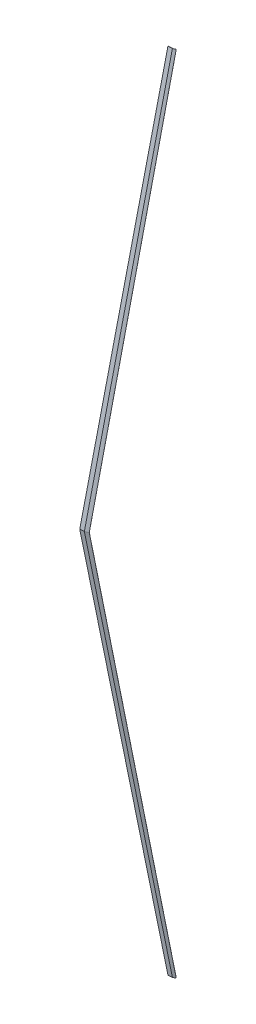
ISO-10303-21;
HEADER;
FILE_DESCRIPTION(('STEP AP214'),'2;1');
FILE_NAME('part.step','',(''),(''),'','','');
FILE_SCHEMA(('AUTOMOTIVE_DESIGN { 1 0 10303 214 1 1 1 1 }'));
ENDSEC;
DATA;
#1=APPLICATION_CONTEXT('core data for automotive mechanical design processes');
#2=APPLICATION_PROTOCOL_DEFINITION('international standard','automotive_design',2000,#1);
#3=PRODUCT_CONTEXT('',#1,'mechanical');
#4=PRODUCT('Part','Part','',(#3));
#5=PRODUCT_RELATED_PRODUCT_CATEGORY('part','',(#4));
#6=PRODUCT_DEFINITION_FORMATION('','',#4);
#7=PRODUCT_DEFINITION_CONTEXT('part definition',#1,'design');
#8=PRODUCT_DEFINITION('design','',#6,#7);
#9=PRODUCT_DEFINITION_SHAPE('','',#8);
#10=(LENGTH_UNIT() NAMED_UNIT(*) SI_UNIT(.MILLI.,.METRE.));
#11=(NAMED_UNIT(*) PLANE_ANGLE_UNIT() SI_UNIT($,.RADIAN.));
#12=(NAMED_UNIT(*) SI_UNIT($,.STERADIAN.) SOLID_ANGLE_UNIT());
#13=UNCERTAINTY_MEASURE_WITH_UNIT(LENGTH_MEASURE(1.E-05),#10,'distance_accuracy_value','');
#14=(GEOMETRIC_REPRESENTATION_CONTEXT(3) GLOBAL_UNCERTAINTY_ASSIGNED_CONTEXT((#13)) GLOBAL_UNIT_ASSIGNED_CONTEXT((#10,
#11,#12)) REPRESENTATION_CONTEXT('',''));
#15=CARTESIAN_POINT('',(0.,0.,0.));
#16=DIRECTION('',(0.,0.,1.));
#17=DIRECTION('',(1.,0.,0.));
#18=AXIS2_PLACEMENT_3D('',#15,#16,#17);
#19=CARTESIAN_POINT('',(-233.035520573233,-390.348529640337,62.8481939552668));
#20=DIRECTION('',(0.,-1.,0.));
#21=DIRECTION('',(0.,0.,-1.));
#22=AXIS2_PLACEMENT_3D('',#19,#20,#21);
#23=PLANE('',#22);
#24=CARTESIAN_POINT('',(-233.035520573233,-390.348529640337,62.8481939552668));
#25=DIRECTION('',(0.,-1.,0.));
#26=DIRECTION('',(0.,0.,-1.));
#27=AXIS2_PLACEMENT_3D('',#24,#25,#26);
#28=CIRCLE('',#27,25.3190411966632);
#29=CARTESIAN_POINT('',(-219.487021161743,-390.348529640337,84.2372568336441));
#30=VERTEX_POINT('',#29);
#31=CARTESIAN_POINT('',(-225.419030916607,-390.348529640337,86.9944759139622));
#32=VERTEX_POINT('',#31);
#33=EDGE_CURVE('E121',#30,#32,#28,.T.);
#34=ORIENTED_EDGE('',*,*,#33,.T.);
#35=CARTESIAN_POINT('',(-225.419030916607,-390.348529640337,86.9944759139622));
#36=CARTESIAN_POINT('',(-226.05242857636,-390.348529640337,87.0388025008623));
#37=CARTESIAN_POINT('',(-228.387446488872,-390.348529640337,87.204047564457));
#38=CARTESIAN_POINT('',(-230.927518861756,-390.348529640337,87.3976454493604));
#39=CARTESIAN_POINT('',(-232.833242050514,-390.348529640337,87.557767353734));
#40=CARTESIAN_POINT('',(-233.039030916517,-390.348529640337,87.5751812859225));
#41=B_SPLINE_CURVE_WITH_KNOTS('',3,(#35,#36,#37,#38,#39,#40),.UNSPECIFIED.,.F.,.F.,(4,1,1,4),
(25.9390049786338,26.0139986929523,26.2154839827386,26.2398765286644),.UNSPECIFIED.);
#42=CARTESIAN_POINT('',(-233.039030916517,-390.348529640337,87.5751812859225));
#43=VERTEX_POINT('',#42);
#44=EDGE_CURVE('E131',#32,#43,#41,.T.);
#45=ORIENTED_EDGE('',*,*,#44,.T.);
#46=DIRECTION('',(0.0820459575074956,0.,0.996628547080946));
#47=VECTOR('',#46,1.);
#48=CARTESIAN_POINT('',(-233.058807937216,-390.348529640337,87.3349458861057));
#49=LINE('',#48,#47);
#50=CARTESIAN_POINT('',(-233.058807937216,-390.348529640337,87.3349458861057));
#51=VERTEX_POINT('',#50);
#52=EDGE_CURVE('E345',#51,#43,#49,.T.);
#53=ORIENTED_EDGE('',*,*,#52,.F.);
#54=CARTESIAN_POINT('',(-225.466843131213,-390.348529640337,86.7432020515552));
#55=CARTESIAN_POINT('',(-227.999061344912,-390.348529640337,86.9206405705874));
#56=CARTESIAN_POINT('',(-230.529137195553,-390.348529640337,87.1266945182334));
#57=CARTESIAN_POINT('',(-233.058807937216,-390.348529640337,87.3349458861057));
#58=B_SPLINE_CURVE_WITH_KNOTS('',3,(#54,#55,#56,#57),.UNSPECIFIED.,.F.,.F.,(4,4),
(25.9401918871156,26.2399437403012),.UNSPECIFIED.);
#59=CARTESIAN_POINT('',(-225.466843131213,-390.348529640337,86.7432020515552));
#60=VERTEX_POINT('',#59);
#61=EDGE_CURVE('E347',#60,#51,#58,.T.);
#62=ORIENTED_EDGE('',*,*,#61,.F.);
#63=CARTESIAN_POINT('',(-233.035520573145,-390.348529640337,62.8481939550198));
#64=DIRECTION('',(0.,-1.,0.));
#65=DIRECTION('',(0.,0.,-1.));
#66=AXIS2_PLACEMENT_3D('',#63,#64,#65);
#67=CIRCLE('',#66,25.0650411959269);
#68=CARTESIAN_POINT('',(-219.622939375828,-390.348529640337,84.0226822789179));
#69=VERTEX_POINT('',#68);
#70=EDGE_CURVE('E123',#69,#60,#67,.T.);
#71=ORIENTED_EDGE('',*,*,#70,.F.);
#72=DIRECTION('',(0.535111077182952,0.,0.844781708535466));
#73=VECTOR('',#72,1.);
#74=CARTESIAN_POINT('',(-219.622939375828,-390.348529640337,84.0226822789178));
#75=LINE('',#74,#73);
#76=EDGE_CURVE('E105',#69,#30,#75,.T.);
#77=ORIENTED_EDGE('',*,*,#76,.T.);
#78=EDGE_LOOP('',(#34,#45,#53,#62,#71,#77));
#79=FACE_BOUND('',#78,.T.);
#80=ADVANCED_FACE('F46',(#79),#23,.T.);
#81=CARTESIAN_POINT('',(-182.173466429646,320.773624764959,-38.026053356457));
#82=DIRECTION('',(0.,0.990268068741507,-0.139173100960514));
#83=DIRECTION('',(0.,0.139173100960514,0.990268068741507));
#84=AXIS2_PLACEMENT_3D('',#81,#82,#83);
#85=PLANE('',#84);
#86=CARTESIAN_POINT('',(-182.173466429646,320.773624764959,-38.026053356457));
#87=DIRECTION('',(0.,0.990268068741507,-0.139173100960514));
#88=DIRECTION('',(0.,0.139173100960514,0.990268068741507));
#89=AXIS2_PLACEMENT_3D('',#86,#87,#88);
#90=CIRCLE('',#89,19.6993494457085);
#91=CARTESIAN_POINT('',(-175.753410921286,323.365561729886,-19.5834635539491));
#92=VERTEX_POINT('',#91);
#93=CARTESIAN_POINT('',(-171.230800894713,323.053356794265,-21.8049171000385));
#94=VERTEX_POINT('',#93);
#95=EDGE_CURVE('E176',#92,#94,#90,.T.);
#96=ORIENTED_EDGE('',*,*,#95,.T.);
#97=DIRECTION('',(0.555483599349926,0.115726259671109,0.823435124145057));
#98=VECTOR('',#97,1.);
#99=CARTESIAN_POINT('',(-171.371893728947,323.023962324309,-22.0140696215703));
#100=LINE('',#99,#98);
#101=CARTESIAN_POINT('',(-171.371893728947,323.023962324309,-22.0140696215703));
#102=VERTEX_POINT('',#101);
#103=EDGE_CURVE('E109',#102,#94,#100,.T.);
#104=ORIENTED_EDGE('',*,*,#103,.F.);
#105=CARTESIAN_POINT('',(-182.173466429646,320.773624764959,-38.026053356457));
#106=DIRECTION('',(0.,0.990268068741507,-0.139173100960514));
#107=DIRECTION('',(0.,0.139173100960514,0.990268068741507));
#108=AXIS2_PLACEMENT_3D('',#105,#106,#107);
#109=CIRCLE('',#108,19.4453494457098);
#110=CARTESIAN_POINT('',(-175.800812821062,323.330439180313,-19.8333734797535));
#111=VERTEX_POINT('',#110);
#112=EDGE_CURVE('E294',#111,#102,#109,.T.);
#113=ORIENTED_EDGE('',*,*,#112,.F.);
#114=CARTESIAN_POINT('',(-175.800812821062,323.330439180313,-19.8333734797535));
#115=CARTESIAN_POINT('',(-178.329054778178,323.343965245203,-19.7371305271745));
#116=CARTESIAN_POINT('',(-180.856958237986,323.358467984337,-19.6339381762459));
#117=CARTESIAN_POINT('',(-183.384521368774,323.373920571786,-19.5239873033771));
#118=B_SPLINE_CURVE_WITH_KNOTS('',3,(#114,#115,#116,#117),.UNSPECIFIED.,.F.,.F.,(4,4),
(17.9263680857963,18.2251470740458),.UNSPECIFIED.);
#119=CARTESIAN_POINT('',(-183.384521368774,323.373920571786,-19.5239873033771));
#120=VERTEX_POINT('',#119);
#121=EDGE_CURVE('E297',#111,#120,#118,.T.);
#122=ORIENTED_EDGE('',*,*,#121,.T.);
#123=DIRECTION('',(0.0438859264504888,0.13903901444274,0.98931399359474));
#124=VECTOR('',#123,1.);
#125=CARTESIAN_POINT('',(-183.384521368774,323.373920571786,-19.5239873033771));
#126=LINE('',#125,#124);
#127=CARTESIAN_POINT('',(-183.373410921285,323.409120595892,-19.2735261176268));
#128=VERTEX_POINT('',#127);
#129=EDGE_CURVE('E57',#120,#128,#126,.T.);
#130=ORIENTED_EDGE('',*,*,#129,.T.);
#131=CARTESIAN_POINT('',(-175.753410921286,323.365561729886,-19.5834635539491));
#132=CARTESIAN_POINT('',(-176.085103513536,323.36733500676,-19.5708460333691));
#133=CARTESIAN_POINT('',(-177.536033603902,323.375161982005,-19.5151542106975));
#134=CARTESIAN_POINT('',(-180.076120457415,323.389400616283,-19.4138410634644));
#135=CARTESIAN_POINT('',(-182.284327155147,323.402490644535,-19.3207006727781));
#136=CARTESIAN_POINT('',(-183.373410921285,323.409120595892,-19.2735261176268));
#137=B_SPLINE_CURVE_WITH_KNOTS('',3,(#131,#132,#133,#134,#135,#136),.UNSPECIFIED.,.F.,.F.,(4,1,
1,4),(17.924884890901,17.9640900656302,18.0963832191326,18.2251381301152),.UNSPECIFIED.);
#138=EDGE_CURVE('E12',#92,#128,#137,.T.);
#139=ORIENTED_EDGE('',*,*,#138,.F.);
#140=EDGE_LOOP('',(#96,#104,#113,#122,#130,#139));
#141=FACE_BOUND('',#140,.T.);
#142=ADVANCED_FACE('F255',(#141),#85,.T.);
#143=CARTESIAN_POINT('',(-183.384521368774,323.373920571786,-19.5239873033771));
#144=CARTESIAN_POINT('',(-233.058807937216,-390.348529640337,87.3349458861057));
#145=CARTESIAN_POINT('',(-182.120712190387,323.366194109246,-19.5789639409972));
#146=CARTESIAN_POINT('',(-231.793895060903,-390.348529640337,87.2308138216465));
#147=CARTESIAN_POINT('',(-180.856832215005,323.358706318364,-19.6322423415263));
#148=CARTESIAN_POINT('',(-230.528857934003,-390.348529640337,87.1283360371742));
#149=CARTESIAN_POINT('',(-178.328930670252,323.344208079916,-19.7354026684028));
#150=CARTESIAN_POINT('',(-227.998535179031,-390.348529640337,86.9266890282033));
#151=CARTESIAN_POINT('',(-177.064907796396,323.337202073641,-19.7852529933325));
#152=CARTESIAN_POINT('',(-226.732917370597,-390.348529640337,86.8319188678255));
#153=CARTESIAN_POINT('',(-175.800812821062,323.330439180313,-19.8333734797535));
#154=CARTESIAN_POINT('',(-225.466843131213,-390.348529640337,86.7432020515552));
#155=B_SPLINE_SURFACE_WITH_KNOTS('',3,1,((#143,#144),(#145,#146),(#147,#148),(#149,#150),(#151,
#152),(#153,#154)),.UNSPECIFIED.,.F.,.F.,.F.,(4,2,4),(2,2),(0.,0.5,1.),(0.,1.),.UNSPECIFIED.);
#156=DIRECTION('',(-0.0686658750010849,-0.986698364212233,0.147347669378374));
#157=VECTOR('',#156,1.);
#158=CARTESIAN_POINT('',(-200.633827976137,-33.509045230012,33.4549142859008));
#159=LINE('',#158,#157);
#160=EDGE_CURVE('E301',#111,#60,#159,.T.);
#161=DIRECTION('',(0.068669207938254,0.986642360253912,-0.147720658114301));
#162=VECTOR('',#161,1.);
#163=CARTESIAN_POINT('',(-208.221664652995,-33.4873045342752,33.9054792913643));
#164=LINE('',#163,#162);
#165=EDGE_CURVE('E190',#51,#120,#164,.T.);
#166=ORIENTED_EDGE('',*,*,#121,.F.);
#167=ORIENTED_EDGE('',*,*,#160,.T.);
#168=ORIENTED_EDGE('',*,*,#61,.T.);
#169=ORIENTED_EDGE('',*,*,#165,.T.);
#170=EDGE_LOOP('',(#166,#167,#168,#169));
#171=FACE_BOUND('',#170,.T.);
#172=ADVANCED_FACE('F208',(#171),#155,.T.);
#173=CARTESIAN_POINT('',(-175.800812821062,323.330439180313,-19.8333734797536));
#174=CARTESIAN_POINT('',(-225.466843131213,-390.348529640337,86.7432020515556));
#175=CARTESIAN_POINT('',(-174.24313822684,323.255240806138,-20.3684377145303));
#176=CARTESIAN_POINT('',(-223.418438427037,-390.348529640337,86.0943755513172));
#177=CARTESIAN_POINT('',(-172.742855040637,323.151422681566,-21.1071420547403));
#178=CARTESIAN_POINT('',(-221.438126937848,-390.348529640337,85.1724786844571));
#179=CARTESIAN_POINT('',(-171.371893728947,323.023962324309,-22.0140696215703));
#180=CARTESIAN_POINT('',(-219.622939375828,-390.348529640337,84.0226822789179));
#181=B_SPLINE_SURFACE_WITH_KNOTS('',3,1,((#173,#174),(#175,#176),(#177,#178),(#179,#180)),
.UNSPECIFIED.,.F.,.F.,.F.,(4,4),(2,2),(0.,1.),(0.,1.),.UNSPECIFIED.);
#182=DIRECTION('',(-0.0667536638312013,-0.986926332406081,0.146698203017602));
#183=VECTOR('',#182,1.);
#184=CARTESIAN_POINT('',(-195.497416552388,-33.662283658014,31.0043063286738));
#185=LINE('',#184,#183);
#186=EDGE_CURVE('E97',#102,#69,#185,.T.);
#187=ORIENTED_EDGE('',*,*,#112,.T.);
#188=ORIENTED_EDGE('',*,*,#186,.T.);
#189=ORIENTED_EDGE('',*,*,#70,.T.);
#190=ORIENTED_EDGE('',*,*,#160,.F.);
#191=EDGE_LOOP('',(#187,#188,#189,#190));
#192=FACE_BOUND('',#191,.T.);
#193=ADVANCED_FACE('F196',(#192),#181,.T.);
#194=CARTESIAN_POINT('',(-183.373410921285,323.409120595892,-19.2735261176268));
#195=CARTESIAN_POINT('',(-233.039030916517,-390.348529640337,87.5751812859225));
#196=CARTESIAN_POINT('',(-183.375262662533,323.403253925208,-19.3152696485851));
#197=CARTESIAN_POINT('',(-233.042327086633,-390.348529640337,87.5351420526196));
#198=CARTESIAN_POINT('',(-183.377114403781,323.397387254524,-19.3570131795435));
#199=CARTESIAN_POINT('',(-233.04562325675,-390.348529640337,87.4951028193168));
#200=CARTESIAN_POINT('',(-183.380817886278,323.385653913155,-19.4405002414603));
#201=CARTESIAN_POINT('',(-233.052215596983,-390.348529640337,87.4150243527112));
#202=CARTESIAN_POINT('',(-183.382669627526,323.379787242471,-19.4822437724187));
#203=CARTESIAN_POINT('',(-233.055511767099,-390.348529640337,87.3749851194084));
#204=CARTESIAN_POINT('',(-183.384521368774,323.373920571786,-19.5239873033771));
#205=CARTESIAN_POINT('',(-233.058807937216,-390.348529640337,87.3349458861057));
#206=B_SPLINE_SURFACE_WITH_KNOTS('',3,1,((#194,#195),(#196,#197),(#198,#199),(#200,#201),(#202,
#203),(#204,#205)),.UNSPECIFIED.,.F.,.F.,.F.,(4,2,4),(2,2),(0.,0.5,1.),(0.,1.),.UNSPECIFIED.);
#207=DIRECTION('',(-0.0686541310842447,-0.986646523015419,0.147699860889074));
#208=VECTOR('',#207,1.);
#209=CARTESIAN_POINT('',(-208.206220918901,-33.4697045222222,34.1508275841478));
#210=LINE('',#209,#208);
#211=EDGE_CURVE('E66',#128,#43,#210,.T.);
#212=ORIENTED_EDGE('',*,*,#129,.F.);
#213=ORIENTED_EDGE('',*,*,#165,.F.);
#214=ORIENTED_EDGE('',*,*,#52,.T.);
#215=ORIENTED_EDGE('',*,*,#211,.F.);
#216=EDGE_LOOP('',(#212,#213,#214,#215));
#217=FACE_BOUND('',#216,.T.);
#218=ADVANCED_FACE('F207',(#217),#206,.T.);
#219=CARTESIAN_POINT('',(-171.371893728947,323.023962324309,-22.0140696215703));
#220=CARTESIAN_POINT('',(-219.622939375828,-390.348529640337,84.0226822789179));
#221=CARTESIAN_POINT('',(-171.348378256575,323.028861402635,-21.9792108679816));
#222=CARTESIAN_POINT('',(-219.600286340147,-390.348529640337,84.0584447047056));
#223=CARTESIAN_POINT('',(-171.324862784203,323.033760480961,-21.944352114393));
#224=CARTESIAN_POINT('',(-219.577633304466,-390.348529640337,84.0942071304933));
#225=CARTESIAN_POINT('',(-171.277831839458,323.043558637613,-21.8746346072158));
#226=CARTESIAN_POINT('',(-219.532327233105,-390.348529640337,84.1657319820687));
#227=CARTESIAN_POINT('',(-171.254316367085,323.048457715939,-21.8397758536271));
#228=CARTESIAN_POINT('',(-219.509674197424,-390.348529640337,84.2014944078564));
#229=CARTESIAN_POINT('',(-171.230800894713,323.053356794265,-21.8049171000385));
#230=CARTESIAN_POINT('',(-219.487021161743,-390.348529640337,84.2372568336441));
#231=B_SPLINE_SURFACE_WITH_KNOTS('',3,1,((#219,#220),(#221,#222),(#223,#224),(#225,#226),(#227,
#228),(#229,#230)),.UNSPECIFIED.,.F.,.F.,.F.,(4,2,4),(2,2),(0.,0.5,1.),(0.,1.),.UNSPECIFIED.);
#232=DIRECTION('',(-0.0667580380697901,-0.986925831118192,0.146699584950808));
#233=VECTOR('',#232,1.);
#234=CARTESIAN_POINT('',(-195.358911028228,-33.6475864230359,31.2161698668028));
#235=LINE('',#234,#233);
#236=EDGE_CURVE('E102',#94,#30,#235,.T.);
#237=ORIENTED_EDGE('',*,*,#103,.T.);
#238=ORIENTED_EDGE('',*,*,#236,.T.);
#239=ORIENTED_EDGE('',*,*,#76,.F.);
#240=ORIENTED_EDGE('',*,*,#186,.F.);
#241=EDGE_LOOP('',(#237,#238,#239,#240));
#242=FACE_BOUND('',#241,.T.);
#243=ADVANCED_FACE('F104',(#242),#231,.T.);
#244=CARTESIAN_POINT('',(-171.230800894713,323.053356794265,-21.8049171000385));
#245=CARTESIAN_POINT('',(-219.487021161743,-390.348529640337,84.2372568336441));
#246=CARTESIAN_POINT('',(-172.630094993278,323.183451293789,-20.8792466370795));
#247=CARTESIAN_POINT('',(-221.329062824257,-390.348529640337,85.4040634638556));
#248=CARTESIAN_POINT('',(-174.162486175636,323.289235362639,-20.1265538764737));
#249=CARTESIAN_POINT('',(-223.339535540132,-390.348529640337,86.3385382812859));
#250=CARTESIAN_POINT('',(-175.753410921286,323.365561729886,-19.5834635539491));
#251=CARTESIAN_POINT('',(-225.419030916607,-390.348529640337,86.9944759139622));
#252=B_SPLINE_SURFACE_WITH_KNOTS('',3,1,((#244,#245),(#246,#247),(#248,#249),(#250,#251)),
.UNSPECIFIED.,.F.,.F.,.F.,(4,4),(2,2),(0.,1.),(0.,1.),.UNSPECIFIED.);
#253=DIRECTION('',(-0.0686620015226568,-0.986699411645749,0.147342460291785));
#254=VECTOR('',#253,1.);
#255=CARTESIAN_POINT('',(-200.586220918946,-33.4914839552254,33.7055061800065));
#256=LINE('',#255,#254);
#257=EDGE_CURVE('E115',#92,#32,#256,.T.);
#258=ORIENTED_EDGE('',*,*,#95,.F.);
#259=ORIENTED_EDGE('',*,*,#257,.T.);
#260=ORIENTED_EDGE('',*,*,#33,.F.);
#261=ORIENTED_EDGE('',*,*,#236,.F.);
#262=EDGE_LOOP('',(#258,#259,#260,#261));
#263=FACE_BOUND('',#262,.T.);
#264=ADVANCED_FACE('F129',(#263),#252,.T.);
#265=CARTESIAN_POINT('',(-175.753410921286,323.365561729886,-19.5834635539491));
#266=CARTESIAN_POINT('',(-225.419030916607,-390.348529640337,86.9944759139622));
#267=CARTESIAN_POINT('',(-177.023549331334,323.372352074688,-19.5351477401424));
#268=CARTESIAN_POINT('',(-226.689649843217,-390.348529640337,87.0833966723516));
#269=CARTESIAN_POINT('',(-178.293618624616,323.379376856949,-19.4851638171366));
#270=CARTESIAN_POINT('',(-227.960011022965,-390.348529640337,87.175561589449));
#271=CARTESIAN_POINT('',(-180.83361897765,323.393895296389,-19.3818597527269));
#272=CARTESIAN_POINT('',(-230.500217888736,-390.348529640337,87.3663797410599));
#273=CARTESIAN_POINT('',(-182.103549684367,323.40139013613,-19.3285311969586));
#274=CARTESIAN_POINT('',(-231.769856708958,-390.348529640337,87.4677832812825));
#275=CARTESIAN_POINT('',(-183.373410921285,323.409120595892,-19.2735261176268));
#276=CARTESIAN_POINT('',(-233.039030916517,-390.348529640337,87.5751812859225));
#277=B_SPLINE_SURFACE_WITH_KNOTS('',3,1,((#265,#266),(#267,#268),(#269,#270),(#271,#272),(#273,
#274),(#275,#276)),.UNSPECIFIED.,.F.,.F.,.F.,(4,2,4),(2,2),(0.,0.5,1.),(0.,1.),.UNSPECIFIED.);
#278=ORIENTED_EDGE('',*,*,#138,.T.);
#279=ORIENTED_EDGE('',*,*,#211,.T.);
#280=ORIENTED_EDGE('',*,*,#44,.F.);
#281=ORIENTED_EDGE('',*,*,#257,.F.);
#282=EDGE_LOOP('',(#278,#279,#280,#281));
#283=FACE_BOUND('',#282,.T.);
#284=ADVANCED_FACE('F152',(#283),#277,.T.);
#285=CLOSED_SHELL('',(#80,#142,#172,#193,#218,#243,#264,#284));
#286=MANIFOLD_SOLID_BREP('B2',#285);
#287=CARTESIAN_POINT('',(-233.035520573233,-390.348529640337,62.8481939552668));
#288=DIRECTION('',(0.,1.,0.));
#289=DIRECTION('',(0.,0.,-1.));
#290=AXIS2_PLACEMENT_3D('',#287,#288,#289);
#291=PLANE('',#290);
#292=CARTESIAN_POINT('',(-233.035520573233,-390.348529640337,62.8481939552668));
#293=DIRECTION('',(0.,-1.,0.));
#294=DIRECTION('',(0.,0.,-1.));
#295=AXIS2_PLACEMENT_3D('',#292,#293,#294);
#296=CIRCLE('',#295,25.3190411966632);
#297=CARTESIAN_POINT('',(-219.487021161743,-390.348529640337,84.2372568336441));
#298=VERTEX_POINT('',#297);
#299=CARTESIAN_POINT('',(-225.419030916607,-390.348529640337,86.9944759139622));
#300=VERTEX_POINT('',#299);
#301=EDGE_CURVE('E621',#298,#300,#296,.T.);
#302=ORIENTED_EDGE('',*,*,#301,.F.);
#303=DIRECTION('',(0.535111077182952,0.,0.844781708535466));
#304=VECTOR('',#303,1.);
#305=CARTESIAN_POINT('',(-219.622939375828,-390.348529640337,84.0226822789178));
#306=LINE('',#305,#304);
#307=CARTESIAN_POINT('',(-219.622939375828,-390.348529640337,84.0226822789179));
#308=VERTEX_POINT('',#307);
#309=EDGE_CURVE('E630',#308,#298,#306,.T.);
#310=ORIENTED_EDGE('',*,*,#309,.F.);
#311=CARTESIAN_POINT('',(-233.035520573145,-390.348529640337,62.8481939550198));
#312=DIRECTION('',(0.,-1.,0.));
#313=DIRECTION('',(0.,0.,-1.));
#314=AXIS2_PLACEMENT_3D('',#311,#312,#313);
#315=CIRCLE('',#314,25.0650411959269);
#316=CARTESIAN_POINT('',(-225.466843131213,-390.348529640337,86.7432020515552));
#317=VERTEX_POINT('',#316);
#318=EDGE_CURVE('E636',#308,#317,#315,.T.);
#319=ORIENTED_EDGE('',*,*,#318,.T.);
#320=CARTESIAN_POINT('',(-225.466843131213,-390.348529640337,86.7432020515552));
#321=CARTESIAN_POINT('',(-227.999061344912,-390.348529640337,86.9206405705874));
#322=CARTESIAN_POINT('',(-230.529137195553,-390.348529640337,87.1266945182334));
#323=CARTESIAN_POINT('',(-233.058807937216,-390.348529640337,87.3349458861057));
#324=B_SPLINE_CURVE_WITH_KNOTS('',3,(#320,#321,#322,#323),.UNSPECIFIED.,.F.,.F.,(4,4),
(25.9401918871156,26.2399437403012),.UNSPECIFIED.);
#325=CARTESIAN_POINT('',(-233.058807937216,-390.348529640337,87.3349458861057));
#326=VERTEX_POINT('',#325);
#327=EDGE_CURVE('E660',#317,#326,#324,.T.);
#328=ORIENTED_EDGE('',*,*,#327,.T.);
#329=DIRECTION('',(0.0820459575074956,0.,0.996628547080946));
#330=VECTOR('',#329,1.);
#331=CARTESIAN_POINT('',(-233.058807937216,-390.348529640337,87.3349458861057));
#332=LINE('',#331,#330);
#333=CARTESIAN_POINT('',(-233.039030916517,-390.348529640337,87.5751812859225));
#334=VERTEX_POINT('',#333);
#335=EDGE_CURVE('E648',#326,#334,#332,.T.);
#336=ORIENTED_EDGE('',*,*,#335,.T.);
#337=CARTESIAN_POINT('',(-225.419030916607,-390.348529640337,86.9944759139622));
#338=CARTESIAN_POINT('',(-226.05242857636,-390.348529640337,87.0388025008623));
#339=CARTESIAN_POINT('',(-228.387446488872,-390.348529640337,87.204047564457));
#340=CARTESIAN_POINT('',(-230.927518861756,-390.348529640337,87.3976454493604));
#341=CARTESIAN_POINT('',(-232.833242050514,-390.348529640337,87.557767353734));
#342=CARTESIAN_POINT('',(-233.039030916517,-390.348529640337,87.5751812859225));
#343=B_SPLINE_CURVE_WITH_KNOTS('',3,(#337,#338,#339,#340,#341,#342),.UNSPECIFIED.,.F.,.F.,(4,1,
1,4),(25.9390049786338,26.0139986929523,26.2154839827386,26.2398765286644),.UNSPECIFIED.);
#344=EDGE_CURVE('E642',#300,#334,#343,.T.);
#345=ORIENTED_EDGE('',*,*,#344,.F.);
#346=EDGE_LOOP('',(#302,#310,#319,#328,#336,#345));
#347=FACE_BOUND('',#346,.T.);
#348=ADVANCED_FACE('F560',(#347),#291,.T.);
#349=CARTESIAN_POINT('',(-182.173466429646,-1101.47068404563,-38.026053356457));
#350=DIRECTION('',(0.,-0.990268068741507,-0.139173100960514));
#351=DIRECTION('',(0.,-0.139173100960514,0.990268068741507));
#352=AXIS2_PLACEMENT_3D('',#349,#350,#351);
#353=PLANE('',#352);
#354=CARTESIAN_POINT('',(-182.173466429646,-1101.47068404563,-38.026053356457));
#355=DIRECTION('',(0.,0.990268068741507,0.139173100960514));
#356=DIRECTION('',(0.,-0.139173100960514,0.990268068741507));
#357=AXIS2_PLACEMENT_3D('',#354,#355,#356);
#358=CIRCLE('',#357,19.6993494457085);
#359=CARTESIAN_POINT('',(-175.753410921286,-1104.06262101056,-19.5834635539491));
#360=VERTEX_POINT('',#359);
#361=CARTESIAN_POINT('',(-171.230800894713,-1103.75041607494,-21.8049171000385));
#362=VERTEX_POINT('',#361);
#363=EDGE_CURVE('E624',#360,#362,#358,.T.);
#364=ORIENTED_EDGE('',*,*,#363,.F.);
#365=CARTESIAN_POINT('',(-175.753410921286,-1104.06262101056,-19.5834635539491));
#366=CARTESIAN_POINT('',(-176.085103513536,-1104.06439428743,-19.5708460333691));
#367=CARTESIAN_POINT('',(-177.536033603902,-1104.07222126268,-19.5151542106975));
#368=CARTESIAN_POINT('',(-180.076120457415,-1104.08645989696,-19.4138410634644));
#369=CARTESIAN_POINT('',(-182.284327155147,-1104.09954992521,-19.3207006727781));
#370=CARTESIAN_POINT('',(-183.373410921285,-1104.10617987657,-19.2735261176268));
#371=B_SPLINE_CURVE_WITH_KNOTS('',3,(#365,#366,#367,#368,#369,#370),.UNSPECIFIED.,.F.,.F.,(4,1,
1,4),(17.924884890901,17.9640900656302,18.0963832191326,18.2251381301152),.UNSPECIFIED.);
#372=CARTESIAN_POINT('',(-183.373410921285,-1104.10617987657,-19.2735261176268));
#373=VERTEX_POINT('',#372);
#374=EDGE_CURVE('E44',#360,#373,#371,.T.);
#375=ORIENTED_EDGE('',*,*,#374,.T.);
#376=DIRECTION('',(0.0438859264504888,-0.13903901444274,0.98931399359474));
#377=VECTOR('',#376,1.);
#378=CARTESIAN_POINT('',(-183.384521368774,-1104.07097985246,-19.5239873033771));
#379=LINE('',#378,#377);
#380=CARTESIAN_POINT('',(-183.384521368774,-1104.07097985246,-19.5239873033771));
#381=VERTEX_POINT('',#380);
#382=EDGE_CURVE('E571',#381,#373,#379,.T.);
#383=ORIENTED_EDGE('',*,*,#382,.F.);
#384=CARTESIAN_POINT('',(-175.800812821062,-1104.02749846099,-19.8333734797535));
#385=CARTESIAN_POINT('',(-178.329054778178,-1104.04102452588,-19.7371305271745));
#386=CARTESIAN_POINT('',(-180.856958237986,-1104.05552726501,-19.6339381762459));
#387=CARTESIAN_POINT('',(-183.384521368774,-1104.07097985246,-19.5239873033771));
#388=B_SPLINE_CURVE_WITH_KNOTS('',3,(#384,#385,#386,#387),.UNSPECIFIED.,.F.,.F.,(4,4),
(17.9263680857963,18.2251470740458),.UNSPECIFIED.);
#389=CARTESIAN_POINT('',(-175.800812821062,-1104.02749846099,-19.8333734797535));
#390=VERTEX_POINT('',#389);
#391=EDGE_CURVE('E731',#390,#381,#388,.T.);
#392=ORIENTED_EDGE('',*,*,#391,.F.);
#393=CARTESIAN_POINT('',(-182.173466429646,-1101.47068404563,-38.026053356457));
#394=DIRECTION('',(0.,0.990268068741507,0.139173100960514));
#395=DIRECTION('',(0.,-0.139173100960514,0.990268068741507));
#396=AXIS2_PLACEMENT_3D('',#393,#394,#395);
#397=CIRCLE('',#396,19.4453494457098);
#398=CARTESIAN_POINT('',(-171.371893728947,-1103.72102160498,-22.0140696215703));
#399=VERTEX_POINT('',#398);
#400=EDGE_CURVE('E808',#390,#399,#397,.T.);
#401=ORIENTED_EDGE('',*,*,#400,.T.);
#402=DIRECTION('',(0.555483599349926,-0.115726259671109,0.823435124145057));
#403=VECTOR('',#402,1.);
#404=CARTESIAN_POINT('',(-171.371893728947,-1103.72102160498,-22.0140696215703));
#405=LINE('',#404,#403);
#406=EDGE_CURVE('E817',#399,#362,#405,.T.);
#407=ORIENTED_EDGE('',*,*,#406,.T.);
#408=EDGE_LOOP('',(#364,#375,#383,#392,#401,#407));
#409=FACE_BOUND('',#408,.T.);
#410=ADVANCED_FACE('F748',(#409),#353,.T.);
#411=CARTESIAN_POINT('',(-183.384521368774,-1104.07097985246,-19.5239873033771));
#412=CARTESIAN_POINT('',(-233.058807937216,-390.348529640337,87.3349458861057));
#413=CARTESIAN_POINT('',(-182.120712190387,-1104.06325338992,-19.5789639409972));
#414=CARTESIAN_POINT('',(-231.793895060903,-390.348529640337,87.2308138216465));
#415=CARTESIAN_POINT('',(-180.856832215005,-1104.05576559904,-19.6322423415263));
#416=CARTESIAN_POINT('',(-230.528857934003,-390.348529640337,87.1283360371742));
#417=CARTESIAN_POINT('',(-178.328930670252,-1104.04126736059,-19.7354026684028));
#418=CARTESIAN_POINT('',(-227.998535179031,-390.348529640337,86.9266890282033));
#419=CARTESIAN_POINT('',(-177.064907796396,-1104.03426135431,-19.7852529933325));
#420=CARTESIAN_POINT('',(-226.732917370597,-390.348529640337,86.8319188678255));
#421=CARTESIAN_POINT('',(-175.800812821062,-1104.02749846099,-19.8333734797535));
#422=CARTESIAN_POINT('',(-225.466843131213,-390.348529640337,86.7432020515552));
#423=B_SPLINE_SURFACE_WITH_KNOTS('',3,1,((#411,#412),(#413,#414),(#415,#416),(#417,#418),(#419,
#420),(#421,#422)),.UNSPECIFIED.,.F.,.F.,.F.,(4,2,4),(2,2),(0.,0.5,1.),(0.,1.),.UNSPECIFIED.);
#424=DIRECTION('',(0.068669207938254,-0.986642360253912,-0.147720658114301));
#425=VECTOR('',#424,1.);
#426=CARTESIAN_POINT('',(-208.221664652995,-747.209754746399,33.9054792913643));
#427=LINE('',#426,#425);
#428=EDGE_CURVE('E675',#326,#381,#427,.T.);
#429=DIRECTION('',(-0.0686658750010849,0.986698364212233,0.147347669378374));
#430=VECTOR('',#429,1.);
#431=CARTESIAN_POINT('',(-200.633827976137,-747.188014050662,33.4549142859008));
#432=LINE('',#431,#430);
#433=EDGE_CURVE('E725',#390,#317,#432,.T.);
#434=ORIENTED_EDGE('',*,*,#391,.T.);
#435=ORIENTED_EDGE('',*,*,#428,.F.);
#436=ORIENTED_EDGE('',*,*,#327,.F.);
#437=ORIENTED_EDGE('',*,*,#433,.F.);
#438=EDGE_LOOP('',(#434,#435,#436,#437));
#439=FACE_BOUND('',#438,.T.);
#440=ADVANCED_FACE('F737',(#439),#423,.F.);
#441=CARTESIAN_POINT('',(-175.800812821062,-1104.02749846099,-19.8333734797536));
#442=CARTESIAN_POINT('',(-225.466843131213,-390.348529640337,86.7432020515556));
#443=CARTESIAN_POINT('',(-174.24313822684,-1103.95230008681,-20.3684377145303));
#444=CARTESIAN_POINT('',(-223.418438427037,-390.348529640337,86.0943755513172));
#445=CARTESIAN_POINT('',(-172.742855040637,-1103.84848196224,-21.1071420547403));
#446=CARTESIAN_POINT('',(-221.438126937848,-390.348529640337,85.1724786844571));
#447=CARTESIAN_POINT('',(-171.371893728947,-1103.72102160498,-22.0140696215703));
#448=CARTESIAN_POINT('',(-219.622939375828,-390.348529640337,84.0226822789179));
#449=B_SPLINE_SURFACE_WITH_KNOTS('',3,1,((#441,#442),(#443,#444),(#445,#446),(#447,#448)),
.UNSPECIFIED.,.F.,.F.,.F.,(4,4),(2,2),(0.,1.),(0.,1.),.UNSPECIFIED.);
#450=DIRECTION('',(-0.0667536638312013,0.986926332406081,0.146698203017602));
#451=VECTOR('',#450,1.);
#452=CARTESIAN_POINT('',(-195.497416552388,-747.03477562266,31.0043063286738));
#453=LINE('',#452,#451);
#454=EDGE_CURVE('E612',#399,#308,#453,.T.);
#455=ORIENTED_EDGE('',*,*,#400,.F.);
#456=ORIENTED_EDGE('',*,*,#433,.T.);
#457=ORIENTED_EDGE('',*,*,#318,.F.);
#458=ORIENTED_EDGE('',*,*,#454,.F.);
#459=EDGE_LOOP('',(#455,#456,#457,#458));
#460=FACE_BOUND('',#459,.T.);
#461=ADVANCED_FACE('F698',(#460),#449,.F.);
#462=CARTESIAN_POINT('',(-183.373410921285,-1104.10617987657,-19.2735261176268));
#463=CARTESIAN_POINT('',(-233.039030916517,-390.348529640337,87.5751812859225));
#464=CARTESIAN_POINT('',(-183.375262662533,-1104.10031320588,-19.3152696485851));
#465=CARTESIAN_POINT('',(-233.042327086633,-390.348529640337,87.5351420526196));
#466=CARTESIAN_POINT('',(-183.377114403781,-1104.0944465352,-19.3570131795435));
#467=CARTESIAN_POINT('',(-233.04562325675,-390.348529640337,87.4951028193168));
#468=CARTESIAN_POINT('',(-183.380817886278,-1104.08271319383,-19.4405002414603));
#469=CARTESIAN_POINT('',(-233.052215596983,-390.348529640337,87.4150243527112));
#470=CARTESIAN_POINT('',(-183.382669627526,-1104.07684652314,-19.4822437724187));
#471=CARTESIAN_POINT('',(-233.055511767099,-390.348529640337,87.3749851194084));
#472=CARTESIAN_POINT('',(-183.384521368774,-1104.07097985246,-19.5239873033771));
#473=CARTESIAN_POINT('',(-233.058807937216,-390.348529640337,87.3349458861057));
#474=B_SPLINE_SURFACE_WITH_KNOTS('',3,1,((#462,#463),(#464,#465),(#466,#467),(#468,#469),(#470,
#471),(#472,#473)),.UNSPECIFIED.,.F.,.F.,.F.,(4,2,4),(2,2),(0.,0.5,1.),(0.,1.),.UNSPECIFIED.);
#475=DIRECTION('',(-0.0686541310842447,0.986646523015419,0.147699860889074));
#476=VECTOR('',#475,1.);
#477=CARTESIAN_POINT('',(-208.206220918901,-747.227354758451,34.1508275841478));
#478=LINE('',#477,#476);
#479=EDGE_CURVE('E580',#373,#334,#478,.T.);
#480=ORIENTED_EDGE('',*,*,#382,.T.);
#481=ORIENTED_EDGE('',*,*,#479,.T.);
#482=ORIENTED_EDGE('',*,*,#335,.F.);
#483=ORIENTED_EDGE('',*,*,#428,.T.);
#484=EDGE_LOOP('',(#480,#481,#482,#483));
#485=FACE_BOUND('',#484,.T.);
#486=ADVANCED_FACE('F674',(#485),#474,.F.);
#487=CARTESIAN_POINT('',(-171.371893728947,-1103.72102160498,-22.0140696215703));
#488=CARTESIAN_POINT('',(-219.622939375828,-390.348529640337,84.0226822789179));
#489=CARTESIAN_POINT('',(-171.348378256575,-1103.72592068331,-21.9792108679816));
#490=CARTESIAN_POINT('',(-219.600286340147,-390.348529640337,84.0584447047056));
#491=CARTESIAN_POINT('',(-171.324862784203,-1103.73081976163,-21.944352114393));
#492=CARTESIAN_POINT('',(-219.577633304466,-390.348529640337,84.0942071304933));
#493=CARTESIAN_POINT('',(-171.277831839458,-1103.74061791829,-21.8746346072158));
#494=CARTESIAN_POINT('',(-219.532327233105,-390.348529640337,84.1657319820687));
#495=CARTESIAN_POINT('',(-171.254316367085,-1103.74551699661,-21.8397758536271));
#496=CARTESIAN_POINT('',(-219.509674197424,-390.348529640337,84.2014944078564));
#497=CARTESIAN_POINT('',(-171.230800894713,-1103.75041607494,-21.8049171000385));
#498=CARTESIAN_POINT('',(-219.487021161743,-390.348529640337,84.2372568336441));
#499=B_SPLINE_SURFACE_WITH_KNOTS('',3,1,((#487,#488),(#489,#490),(#491,#492),(#493,#494),(#495,
#496),(#497,#498)),.UNSPECIFIED.,.F.,.F.,.F.,(4,2,4),(2,2),(0.,0.5,1.),(0.,1.),.UNSPECIFIED.);
#500=DIRECTION('',(-0.0667580380697901,0.986925831118192,0.146699584950808));
#501=VECTOR('',#500,1.);
#502=CARTESIAN_POINT('',(-195.358911028228,-747.049472857638,31.2161698668028));
#503=LINE('',#502,#501);
#504=EDGE_CURVE('E618',#362,#298,#503,.T.);
#505=ORIENTED_EDGE('',*,*,#406,.F.);
#506=ORIENTED_EDGE('',*,*,#454,.T.);
#507=ORIENTED_EDGE('',*,*,#309,.T.);
#508=ORIENTED_EDGE('',*,*,#504,.F.);
#509=EDGE_LOOP('',(#505,#506,#507,#508));
#510=FACE_BOUND('',#509,.T.);
#511=ADVANCED_FACE('F632',(#510),#499,.F.);
#512=CARTESIAN_POINT('',(-171.230800894713,-1103.75041607494,-21.8049171000385));
#513=CARTESIAN_POINT('',(-219.487021161743,-390.348529640337,84.2372568336441));
#514=CARTESIAN_POINT('',(-172.630094993278,-1103.88051057446,-20.8792466370795));
#515=CARTESIAN_POINT('',(-221.329062824257,-390.348529640337,85.4040634638556));
#516=CARTESIAN_POINT('',(-174.162486175636,-1103.98629464331,-20.1265538764737));
#517=CARTESIAN_POINT('',(-223.339535540132,-390.348529640337,86.3385382812859));
#518=CARTESIAN_POINT('',(-175.753410921286,-1104.06262101056,-19.5834635539491));
#519=CARTESIAN_POINT('',(-225.419030916607,-390.348529640337,86.9944759139622));
#520=B_SPLINE_SURFACE_WITH_KNOTS('',3,1,((#512,#513),(#514,#515),(#516,#517),(#518,#519)),
.UNSPECIFIED.,.F.,.F.,.F.,(4,4),(2,2),(0.,1.),(0.,1.),.UNSPECIFIED.);
#521=DIRECTION('',(-0.0686620015226568,0.986699411645749,0.147342460291785));
#522=VECTOR('',#521,1.);
#523=CARTESIAN_POINT('',(-200.586220918946,-747.205575325448,33.7055061800065));
#524=LINE('',#523,#522);
#525=EDGE_CURVE('E627',#360,#300,#524,.T.);
#526=ORIENTED_EDGE('',*,*,#363,.T.);
#527=ORIENTED_EDGE('',*,*,#504,.T.);
#528=ORIENTED_EDGE('',*,*,#301,.T.);
#529=ORIENTED_EDGE('',*,*,#525,.F.);
#530=EDGE_LOOP('',(#526,#527,#528,#529));
#531=FACE_BOUND('',#530,.T.);
#532=ADVANCED_FACE('F619',(#531),#520,.F.);
#533=CARTESIAN_POINT('',(-175.753410921286,-1104.06262101056,-19.5834635539491));
#534=CARTESIAN_POINT('',(-225.419030916607,-390.348529640337,86.9944759139622));
#535=CARTESIAN_POINT('',(-177.023549331334,-1104.06941135536,-19.5351477401424));
#536=CARTESIAN_POINT('',(-226.689649843217,-390.348529640337,87.0833966723516));
#537=CARTESIAN_POINT('',(-178.293618624616,-1104.07643613762,-19.4851638171366));
#538=CARTESIAN_POINT('',(-227.960011022965,-390.348529640337,87.175561589449));
#539=CARTESIAN_POINT('',(-180.83361897765,-1104.09095457706,-19.3818597527269));
#540=CARTESIAN_POINT('',(-230.500217888736,-390.348529640337,87.3663797410599));
#541=CARTESIAN_POINT('',(-182.103549684367,-1104.0984494168,-19.3285311969586));
#542=CARTESIAN_POINT('',(-231.769856708958,-390.348529640337,87.4677832812825));
#543=CARTESIAN_POINT('',(-183.373410921285,-1104.10617987657,-19.2735261176268));
#544=CARTESIAN_POINT('',(-233.039030916517,-390.348529640337,87.5751812859225));
#545=B_SPLINE_SURFACE_WITH_KNOTS('',3,1,((#533,#534),(#535,#536),(#537,#538),(#539,#540),(#541,
#542),(#543,#544)),.UNSPECIFIED.,.F.,.F.,.F.,(4,2,4),(2,2),(0.,0.5,1.),(0.,1.),.UNSPECIFIED.);
#546=ORIENTED_EDGE('',*,*,#374,.F.);
#547=ORIENTED_EDGE('',*,*,#525,.T.);
#548=ORIENTED_EDGE('',*,*,#344,.T.);
#549=ORIENTED_EDGE('',*,*,#479,.F.);
#550=EDGE_LOOP('',(#546,#547,#548,#549));
#551=FACE_BOUND('',#550,.T.);
#552=ADVANCED_FACE('F916',(#551),#545,.F.);
#553=CLOSED_SHELL('',(#348,#410,#440,#461,#486,#511,#532,#552));
#554=MANIFOLD_SOLID_BREP('B6_NOT_SHOWN',#553);
#555=ADVANCED_BREP_SHAPE_REPRESENTATION('',(#18,#286,#554),#14);
#556=SHAPE_DEFINITION_REPRESENTATION(#9,#555);
ENDSEC;
END-ISO-10303-21;
